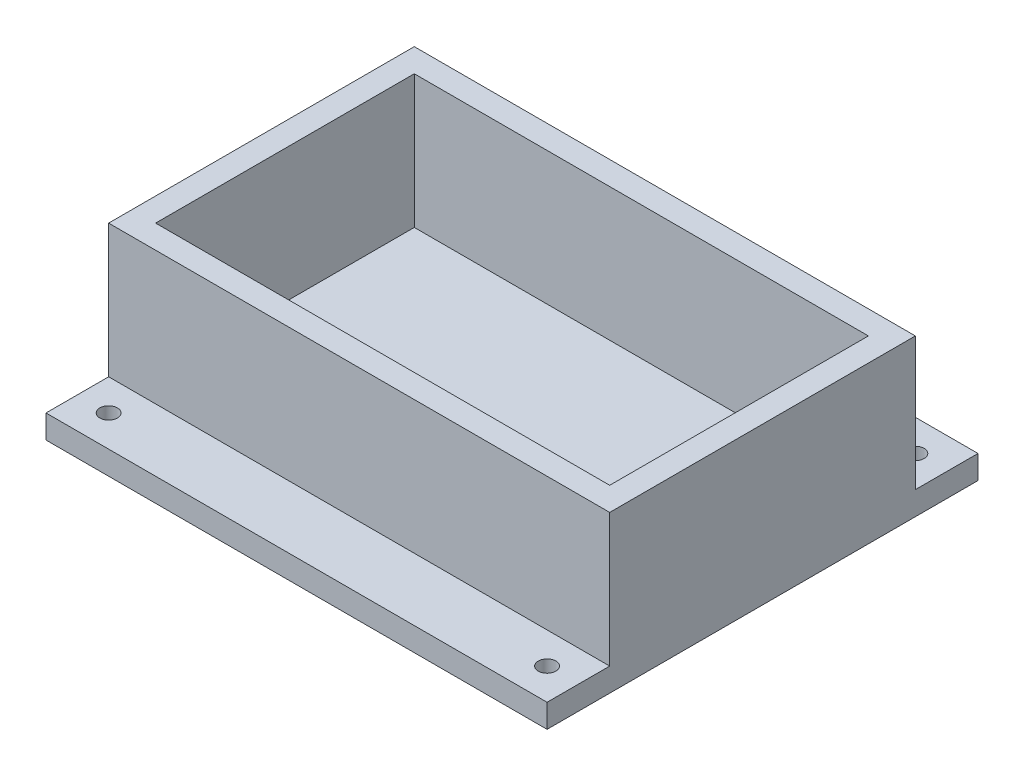
ISO-10303-21;
HEADER;
FILE_DESCRIPTION(('STEP AP214'),'2;1');
FILE_NAME('part.step','',(''),(''),'','','');
FILE_SCHEMA(('AUTOMOTIVE_DESIGN { 1 0 10303 214 1 1 1 1 }'));
ENDSEC;
DATA;
#1=APPLICATION_CONTEXT('core data for automotive mechanical design processes');
#2=APPLICATION_PROTOCOL_DEFINITION('international standard','automotive_design',2000,#1);
#3=PRODUCT_CONTEXT('',#1,'mechanical');
#4=PRODUCT('Part','Part','',(#3));
#5=PRODUCT_RELATED_PRODUCT_CATEGORY('part','',(#4));
#6=PRODUCT_DEFINITION_FORMATION('','',#4);
#7=PRODUCT_DEFINITION_CONTEXT('part definition',#1,'design');
#8=PRODUCT_DEFINITION('design','',#6,#7);
#9=PRODUCT_DEFINITION_SHAPE('','',#8);
#10=(LENGTH_UNIT() NAMED_UNIT(*) SI_UNIT(.MILLI.,.METRE.));
#11=(NAMED_UNIT(*) PLANE_ANGLE_UNIT() SI_UNIT($,.RADIAN.));
#12=(NAMED_UNIT(*) SI_UNIT($,.STERADIAN.) SOLID_ANGLE_UNIT());
#13=UNCERTAINTY_MEASURE_WITH_UNIT(LENGTH_MEASURE(1.E-05),#10,'distance_accuracy_value','');
#14=(GEOMETRIC_REPRESENTATION_CONTEXT(3) GLOBAL_UNCERTAINTY_ASSIGNED_CONTEXT((#13)) GLOBAL_UNIT_ASSIGNED_CONTEXT((#10,
#11,#12)) REPRESENTATION_CONTEXT('',''));
#15=CARTESIAN_POINT('',(0.,0.,0.));
#16=DIRECTION('',(0.,0.,1.));
#17=DIRECTION('',(1.,0.,0.));
#18=AXIS2_PLACEMENT_3D('',#15,#16,#17);
#19=CARTESIAN_POINT('',(101.6,63.5,61.976));
#20=DIRECTION('',(0.,0.,-1.));
#21=DIRECTION('',(-1.,0.,0.));
#22=AXIS2_PLACEMENT_3D('',#19,#20,#21);
#23=PLANE('',#22);
#24=DIRECTION('',(-1.,0.,0.));
#25=VECTOR('',#24,1.);
#26=CARTESIAN_POINT('',(-101.6,9.525,61.976));
#27=LINE('',#26,#25);
#28=CARTESIAN_POINT('',(101.6,9.525,61.976));
#29=VERTEX_POINT('',#28);
#30=CARTESIAN_POINT('',(-101.6,9.525,61.976));
#31=VERTEX_POINT('',#30);
#32=EDGE_CURVE('E67',#29,#31,#27,.T.);
#33=ORIENTED_EDGE('',*,*,#32,.F.);
#34=DIRECTION('',(0.,-1.,0.));
#35=VECTOR('',#34,1.);
#36=CARTESIAN_POINT('',(101.6,63.5,61.976));
#37=LINE('',#36,#35);
#38=CARTESIAN_POINT('',(101.6,63.5,61.976));
#39=VERTEX_POINT('',#38);
#40=EDGE_CURVE('E61',#39,#29,#37,.T.);
#41=ORIENTED_EDGE('',*,*,#40,.F.);
#42=DIRECTION('',(1.,0.,0.));
#43=VECTOR('',#42,1.);
#44=CARTESIAN_POINT('',(101.6,63.5,61.976));
#45=LINE('',#44,#43);
#46=CARTESIAN_POINT('',(-101.6,63.5,61.976));
#47=VERTEX_POINT('',#46);
#48=EDGE_CURVE('E381',#47,#39,#45,.T.);
#49=ORIENTED_EDGE('',*,*,#48,.F.);
#50=DIRECTION('',(0.,-1.,0.));
#51=VECTOR('',#50,1.);
#52=CARTESIAN_POINT('',(-101.6,63.5,61.976));
#53=LINE('',#52,#51);
#54=EDGE_CURVE('E12',#47,#31,#53,.T.);
#55=ORIENTED_EDGE('',*,*,#54,.T.);
#56=EDGE_LOOP('',(#33,#41,#49,#55));
#57=FACE_BOUND('',#56,.T.);
#58=ADVANCED_FACE('F52',(#57),#23,.F.);
#59=CARTESIAN_POINT('',(101.6,63.5,-61.976));
#60=DIRECTION('',(0.,0.,1.));
#61=DIRECTION('',(1.,0.,0.));
#62=AXIS2_PLACEMENT_3D('',#59,#60,#61);
#63=PLANE('',#62);
#64=DIRECTION('',(1.,0.,0.));
#65=VECTOR('',#64,1.);
#66=CARTESIAN_POINT('',(-101.6,9.525,-61.976));
#67=LINE('',#66,#65);
#68=CARTESIAN_POINT('',(-101.6,9.525,-61.976));
#69=VERTEX_POINT('',#68);
#70=CARTESIAN_POINT('',(101.6,9.525,-61.976));
#71=VERTEX_POINT('',#70);
#72=EDGE_CURVE('E75',#69,#71,#67,.T.);
#73=ORIENTED_EDGE('',*,*,#72,.F.);
#74=DIRECTION('',(0.,-1.,0.));
#75=VECTOR('',#74,1.);
#76=CARTESIAN_POINT('',(-101.6,63.5,-61.976));
#77=LINE('',#76,#75);
#78=CARTESIAN_POINT('',(-101.6,63.5,-61.976));
#79=VERTEX_POINT('',#78);
#80=EDGE_CURVE('E202',#79,#69,#77,.T.);
#81=ORIENTED_EDGE('',*,*,#80,.F.);
#82=DIRECTION('',(-1.,0.,0.));
#83=VECTOR('',#82,1.);
#84=CARTESIAN_POINT('',(101.6,63.5,-61.976));
#85=LINE('',#84,#83);
#86=CARTESIAN_POINT('',(101.6,63.5,-61.976));
#87=VERTEX_POINT('',#86);
#88=EDGE_CURVE('E198',#87,#79,#85,.T.);
#89=ORIENTED_EDGE('',*,*,#88,.F.);
#90=DIRECTION('',(0.,-1.,0.));
#91=VECTOR('',#90,1.);
#92=CARTESIAN_POINT('',(101.6,63.5,-61.976));
#93=LINE('',#92,#91);
#94=EDGE_CURVE('E392',#87,#71,#93,.T.);
#95=ORIENTED_EDGE('',*,*,#94,.T.);
#96=EDGE_LOOP('',(#73,#81,#89,#95));
#97=FACE_BOUND('',#96,.T.);
#98=ADVANCED_FACE('F394',(#97),#63,.F.);
#99=CARTESIAN_POINT('',(-101.6,63.5,61.976));
#100=DIRECTION('',(1.,0.,0.));
#101=DIRECTION('',(0.,0.,-1.));
#102=AXIS2_PLACEMENT_3D('',#99,#100,#101);
#103=PLANE('',#102);
#104=DIRECTION('',(0.,0.,1.));
#105=VECTOR('',#104,1.);
#106=CARTESIAN_POINT('',(-101.6,0.,61.976));
#107=LINE('',#106,#105);
#108=CARTESIAN_POINT('',(-101.6,0.,-87.376));
#109=VERTEX_POINT('',#108);
#110=CARTESIAN_POINT('',(-101.6,0.,87.376));
#111=VERTEX_POINT('',#110);
#112=EDGE_CURVE('E156',#109,#111,#107,.T.);
#113=ORIENTED_EDGE('',*,*,#112,.T.);
#114=DIRECTION('',(0.,1.,0.));
#115=VECTOR('',#114,1.);
#116=CARTESIAN_POINT('',(-101.6,0.,87.376));
#117=LINE('',#116,#115);
#118=CARTESIAN_POINT('',(-101.6,9.525,87.376));
#119=VERTEX_POINT('',#118);
#120=EDGE_CURVE('E337',#111,#119,#117,.T.);
#121=ORIENTED_EDGE('',*,*,#120,.T.);
#122=DIRECTION('',(0.,0.,1.));
#123=VECTOR('',#122,1.);
#124=CARTESIAN_POINT('',(-101.6,9.525,61.976));
#125=LINE('',#124,#123);
#126=EDGE_CURVE('E276',#31,#119,#125,.T.);
#127=ORIENTED_EDGE('',*,*,#126,.F.);
#128=ORIENTED_EDGE('',*,*,#54,.F.);
#129=DIRECTION('',(0.,0.,1.));
#130=VECTOR('',#129,1.);
#131=CARTESIAN_POINT('',(-101.6,63.5,61.976));
#132=LINE('',#131,#130);
#133=EDGE_CURVE('E155',#79,#47,#132,.T.);
#134=ORIENTED_EDGE('',*,*,#133,.F.);
#135=ORIENTED_EDGE('',*,*,#80,.T.);
#136=DIRECTION('',(0.,0.,1.));
#137=VECTOR('',#136,1.);
#138=CARTESIAN_POINT('',(-101.6,9.525,-61.976));
#139=LINE('',#138,#137);
#140=CARTESIAN_POINT('',(-101.6,9.525,-87.376));
#141=VERTEX_POINT('',#140);
#142=EDGE_CURVE('E182',#141,#69,#139,.T.);
#143=ORIENTED_EDGE('',*,*,#142,.F.);
#144=DIRECTION('',(0.,1.,0.));
#145=VECTOR('',#144,1.);
#146=CARTESIAN_POINT('',(-101.6,0.,-87.376));
#147=LINE('',#146,#145);
#148=EDGE_CURVE('E166',#109,#141,#147,.T.);
#149=ORIENTED_EDGE('',*,*,#148,.F.);
#150=EDGE_LOOP('',(#113,#121,#127,#128,#134,#135,#143,#149));
#151=FACE_BOUND('',#150,.T.);
#152=ADVANCED_FACE('F54',(#151),#103,.F.);
#153=CARTESIAN_POINT('',(101.6,63.5,61.976));
#154=DIRECTION('',(-1.,0.,0.));
#155=DIRECTION('',(0.,0.,1.));
#156=AXIS2_PLACEMENT_3D('',#153,#154,#155);
#157=PLANE('',#156);
#158=DIRECTION('',(0.,0.,-1.));
#159=VECTOR('',#158,1.);
#160=CARTESIAN_POINT('',(101.6,0.,61.976));
#161=LINE('',#160,#159);
#162=CARTESIAN_POINT('',(101.6,0.,87.376));
#163=VERTEX_POINT('',#162);
#164=CARTESIAN_POINT('',(101.6,0.,-87.376));
#165=VERTEX_POINT('',#164);
#166=EDGE_CURVE('E142',#163,#165,#161,.T.);
#167=ORIENTED_EDGE('',*,*,#166,.T.);
#168=DIRECTION('',(0.,1.,0.));
#169=VECTOR('',#168,1.);
#170=CARTESIAN_POINT('',(101.6,0.,-87.376));
#171=LINE('',#170,#169);
#172=CARTESIAN_POINT('',(101.6,9.525,-87.376));
#173=VERTEX_POINT('',#172);
#174=EDGE_CURVE('E146',#165,#173,#171,.T.);
#175=ORIENTED_EDGE('',*,*,#174,.T.);
#176=DIRECTION('',(0.,0.,-1.));
#177=VECTOR('',#176,1.);
#178=CARTESIAN_POINT('',(101.6,9.525,-61.976));
#179=LINE('',#178,#177);
#180=EDGE_CURVE('E174',#71,#173,#179,.T.);
#181=ORIENTED_EDGE('',*,*,#180,.F.);
#182=ORIENTED_EDGE('',*,*,#94,.F.);
#183=DIRECTION('',(0.,0.,-1.));
#184=VECTOR('',#183,1.);
#185=CARTESIAN_POINT('',(101.6,63.5,61.976));
#186=LINE('',#185,#184);
#187=EDGE_CURVE('E203',#39,#87,#186,.T.);
#188=ORIENTED_EDGE('',*,*,#187,.F.);
#189=ORIENTED_EDGE('',*,*,#40,.T.);
#190=DIRECTION('',(0.,0.,-1.));
#191=VECTOR('',#190,1.);
#192=CARTESIAN_POINT('',(101.6,9.525,61.976));
#193=LINE('',#192,#191);
#194=CARTESIAN_POINT('',(101.6,9.525,87.376));
#195=VERTEX_POINT('',#194);
#196=EDGE_CURVE('E341',#195,#29,#193,.T.);
#197=ORIENTED_EDGE('',*,*,#196,.F.);
#198=DIRECTION('',(0.,1.,0.));
#199=VECTOR('',#198,1.);
#200=CARTESIAN_POINT('',(101.6,0.,87.376));
#201=LINE('',#200,#199);
#202=EDGE_CURVE('E149',#163,#195,#201,.T.);
#203=ORIENTED_EDGE('',*,*,#202,.F.);
#204=EDGE_LOOP('',(#167,#175,#181,#182,#188,#189,#197,#203));
#205=FACE_BOUND('',#204,.T.);
#206=ADVANCED_FACE('F144',(#205),#157,.F.);
#207=CARTESIAN_POINT('',(0.,63.5,0.));
#208=DIRECTION('',(0.,1.,0.));
#209=DIRECTION('',(0.,0.,1.));
#210=AXIS2_PLACEMENT_3D('',#207,#208,#209);
#211=PLANE('',#210);
#212=DIRECTION('',(0.,0.,1.));
#213=VECTOR('',#212,1.);
#214=CARTESIAN_POINT('',(-92.075,63.5,61.976));
#215=LINE('',#214,#213);
#216=CARTESIAN_POINT('',(-92.075,63.5,-52.451));
#217=VERTEX_POINT('',#216);
#218=CARTESIAN_POINT('',(-92.075,63.5,52.451));
#219=VERTEX_POINT('',#218);
#220=EDGE_CURVE('E220',#217,#219,#215,.T.);
#221=ORIENTED_EDGE('',*,*,#220,.F.);
#222=DIRECTION('',(-1.,0.,0.));
#223=VECTOR('',#222,1.);
#224=CARTESIAN_POINT('',(101.6,63.5,-52.451));
#225=LINE('',#224,#223);
#226=CARTESIAN_POINT('',(92.075,63.5,-52.451));
#227=VERTEX_POINT('',#226);
#228=EDGE_CURVE('E382',#227,#217,#225,.T.);
#229=ORIENTED_EDGE('',*,*,#228,.F.);
#230=DIRECTION('',(0.,0.,-1.));
#231=VECTOR('',#230,1.);
#232=CARTESIAN_POINT('',(92.075,63.5,61.976));
#233=LINE('',#232,#231);
#234=CARTESIAN_POINT('',(92.075,63.5,52.451));
#235=VERTEX_POINT('',#234);
#236=EDGE_CURVE('E219',#235,#227,#233,.T.);
#237=ORIENTED_EDGE('',*,*,#236,.F.);
#238=DIRECTION('',(1.,0.,0.));
#239=VECTOR('',#238,1.);
#240=CARTESIAN_POINT('',(101.6,63.5,52.451));
#241=LINE('',#240,#239);
#242=EDGE_CURVE('E214',#219,#235,#241,.T.);
#243=ORIENTED_EDGE('',*,*,#242,.F.);
#244=EDGE_LOOP('',(#221,#229,#237,#243));
#245=FACE_BOUND('',#244,.T.);
#246=ORIENTED_EDGE('',*,*,#133,.T.);
#247=ORIENTED_EDGE('',*,*,#48,.T.);
#248=ORIENTED_EDGE('',*,*,#187,.T.);
#249=ORIENTED_EDGE('',*,*,#88,.T.);
#250=EDGE_LOOP('',(#246,#247,#248,#249));
#251=FACE_BOUND('',#250,.T.);
#252=ADVANCED_FACE('F390',(#245,#251),#211,.T.);
#253=CARTESIAN_POINT('',(0.,0.,0.));
#254=DIRECTION('',(0.,1.,0.));
#255=DIRECTION('',(0.,0.,1.));
#256=AXIS2_PLACEMENT_3D('',#253,#254,#255);
#257=PLANE('',#256);
#258=ORIENTED_EDGE('',*,*,#112,.F.);
#259=DIRECTION('',(-1.,0.,0.));
#260=VECTOR('',#259,1.);
#261=CARTESIAN_POINT('',(-101.6,0.,-87.376));
#262=LINE('',#261,#260);
#263=EDGE_CURVE('E162',#165,#109,#262,.T.);
#264=ORIENTED_EDGE('',*,*,#263,.F.);
#265=ORIENTED_EDGE('',*,*,#166,.F.);
#266=DIRECTION('',(1.,0.,0.));
#267=VECTOR('',#266,1.);
#268=CARTESIAN_POINT('',(-101.6,0.,87.376));
#269=LINE('',#268,#267);
#270=EDGE_CURVE('E286',#111,#163,#269,.T.);
#271=ORIENTED_EDGE('',*,*,#270,.F.);
#272=EDGE_LOOP('',(#258,#264,#265,#271));
#273=FACE_BOUND('',#272,.T.);
#274=CARTESIAN_POINT('',(88.9,0.,-74.676));
#275=DIRECTION('',(0.,1.,0.));
#276=DIRECTION('',(0.,0.,1.));
#277=AXIS2_PLACEMENT_3D('',#274,#275,#276);
#278=CIRCLE('',#277,3.56870000000001);
#279=CARTESIAN_POINT('',(88.9,0.,-71.1073));
#280=VERTEX_POINT('',#279);
#281=EDGE_CURVE('E374',#280,#280,#278,.T.);
#282=ORIENTED_EDGE('',*,*,#281,.T.);
#283=EDGE_LOOP('',(#282));
#284=FACE_BOUND('',#283,.T.);
#285=CARTESIAN_POINT('',(-88.9,0.,-74.676));
#286=DIRECTION('',(0.,1.,0.));
#287=DIRECTION('',(0.,0.,1.));
#288=AXIS2_PLACEMENT_3D('',#285,#286,#287);
#289=CIRCLE('',#288,3.56870000000001);
#290=CARTESIAN_POINT('',(-88.9,0.,-71.1073));
#291=VERTEX_POINT('',#290);
#292=EDGE_CURVE('E375',#291,#291,#289,.T.);
#293=ORIENTED_EDGE('',*,*,#292,.T.);
#294=EDGE_LOOP('',(#293));
#295=FACE_BOUND('',#294,.T.);
#296=CARTESIAN_POINT('',(-88.9,0.,74.676));
#297=DIRECTION('',(0.,1.,0.));
#298=DIRECTION('',(0.,0.,1.));
#299=AXIS2_PLACEMENT_3D('',#296,#297,#298);
#300=CIRCLE('',#299,3.56870000000001);
#301=CARTESIAN_POINT('',(-88.9,0.,78.2447));
#302=VERTEX_POINT('',#301);
#303=EDGE_CURVE('E235',#302,#302,#300,.T.);
#304=ORIENTED_EDGE('',*,*,#303,.T.);
#305=EDGE_LOOP('',(#304));
#306=FACE_BOUND('',#305,.T.);
#307=CARTESIAN_POINT('',(88.9,0.,74.676));
#308=DIRECTION('',(0.,1.,0.));
#309=DIRECTION('',(0.,0.,1.));
#310=AXIS2_PLACEMENT_3D('',#307,#308,#309);
#311=CIRCLE('',#310,3.56870000000001);
#312=CARTESIAN_POINT('',(88.9,0.,78.2447));
#313=VERTEX_POINT('',#312);
#314=EDGE_CURVE('E282',#313,#313,#311,.T.);
#315=ORIENTED_EDGE('',*,*,#314,.T.);
#316=EDGE_LOOP('',(#315));
#317=FACE_BOUND('',#316,.T.);
#318=ADVANCED_FACE('F168',(#273,#284,#295,#306,#317),#257,.F.);
#319=CARTESIAN_POINT('',(-92.075,63.5,61.976));
#320=DIRECTION('',(1.,0.,0.));
#321=DIRECTION('',(0.,0.,-1.));
#322=AXIS2_PLACEMENT_3D('',#319,#320,#321);
#323=PLANE('',#322);
#324=DIRECTION('',(0.,0.,1.));
#325=VECTOR('',#324,1.);
#326=CARTESIAN_POINT('',(-92.075,9.525,61.976));
#327=LINE('',#326,#325);
#328=CARTESIAN_POINT('',(-92.075,9.525,-52.451));
#329=VERTEX_POINT('',#328);
#330=CARTESIAN_POINT('',(-92.075,9.525,52.451));
#331=VERTEX_POINT('',#330);
#332=EDGE_CURVE('E228',#329,#331,#327,.T.);
#333=ORIENTED_EDGE('',*,*,#332,.F.);
#334=DIRECTION('',(0.,-1.,0.));
#335=VECTOR('',#334,1.);
#336=CARTESIAN_POINT('',(-92.075,63.5,-52.451));
#337=LINE('',#336,#335);
#338=EDGE_CURVE('E256',#217,#329,#337,.T.);
#339=ORIENTED_EDGE('',*,*,#338,.F.);
#340=ORIENTED_EDGE('',*,*,#220,.T.);
#341=DIRECTION('',(0.,-1.,0.));
#342=VECTOR('',#341,1.);
#343=CARTESIAN_POINT('',(-92.075,63.5,52.451));
#344=LINE('',#343,#342);
#345=EDGE_CURVE('E238',#219,#331,#344,.T.);
#346=ORIENTED_EDGE('',*,*,#345,.T.);
#347=EDGE_LOOP('',(#333,#339,#340,#346));
#348=FACE_BOUND('',#347,.T.);
#349=ADVANCED_FACE('F417',(#348),#323,.T.);
#350=CARTESIAN_POINT('',(101.6,63.5,52.451));
#351=DIRECTION('',(0.,0.,-1.));
#352=DIRECTION('',(-1.,0.,0.));
#353=AXIS2_PLACEMENT_3D('',#350,#351,#352);
#354=PLANE('',#353);
#355=DIRECTION('',(1.,0.,0.));
#356=VECTOR('',#355,1.);
#357=CARTESIAN_POINT('',(101.6,9.525,52.451));
#358=LINE('',#357,#356);
#359=CARTESIAN_POINT('',(92.075,9.525,52.451));
#360=VERTEX_POINT('',#359);
#361=EDGE_CURVE('E234',#331,#360,#358,.T.);
#362=ORIENTED_EDGE('',*,*,#361,.F.);
#363=ORIENTED_EDGE('',*,*,#345,.F.);
#364=ORIENTED_EDGE('',*,*,#242,.T.);
#365=DIRECTION('',(0.,-1.,0.));
#366=VECTOR('',#365,1.);
#367=CARTESIAN_POINT('',(92.075,63.5,52.451));
#368=LINE('',#367,#366);
#369=EDGE_CURVE('E257',#235,#360,#368,.T.);
#370=ORIENTED_EDGE('',*,*,#369,.T.);
#371=EDGE_LOOP('',(#362,#363,#364,#370));
#372=FACE_BOUND('',#371,.T.);
#373=ADVANCED_FACE('F432',(#372),#354,.T.);
#374=CARTESIAN_POINT('',(92.075,63.5,61.976));
#375=DIRECTION('',(-1.,0.,0.));
#376=DIRECTION('',(0.,0.,1.));
#377=AXIS2_PLACEMENT_3D('',#374,#375,#376);
#378=PLANE('',#377);
#379=DIRECTION('',(0.,0.,-1.));
#380=VECTOR('',#379,1.);
#381=CARTESIAN_POINT('',(92.075,9.525,61.976));
#382=LINE('',#381,#380);
#383=CARTESIAN_POINT('',(92.075,9.525,-52.451));
#384=VERTEX_POINT('',#383);
#385=EDGE_CURVE('E255',#360,#384,#382,.T.);
#386=ORIENTED_EDGE('',*,*,#385,.F.);
#387=ORIENTED_EDGE('',*,*,#369,.F.);
#388=ORIENTED_EDGE('',*,*,#236,.T.);
#389=DIRECTION('',(0.,-1.,0.));
#390=VECTOR('',#389,1.);
#391=CARTESIAN_POINT('',(92.075,63.5,-52.451));
#392=LINE('',#391,#390);
#393=EDGE_CURVE('E261',#227,#384,#392,.T.);
#394=ORIENTED_EDGE('',*,*,#393,.T.);
#395=EDGE_LOOP('',(#386,#387,#388,#394));
#396=FACE_BOUND('',#395,.T.);
#397=ADVANCED_FACE('F428',(#396),#378,.T.);
#398=CARTESIAN_POINT('',(101.6,63.5,-52.451));
#399=DIRECTION('',(0.,0.,1.));
#400=DIRECTION('',(1.,0.,0.));
#401=AXIS2_PLACEMENT_3D('',#398,#399,#400);
#402=PLANE('',#401);
#403=DIRECTION('',(-1.,0.,0.));
#404=VECTOR('',#403,1.);
#405=CARTESIAN_POINT('',(101.6,9.525,-52.451));
#406=LINE('',#405,#404);
#407=EDGE_CURVE('E264',#384,#329,#406,.T.);
#408=ORIENTED_EDGE('',*,*,#407,.F.);
#409=ORIENTED_EDGE('',*,*,#393,.F.);
#410=ORIENTED_EDGE('',*,*,#228,.T.);
#411=ORIENTED_EDGE('',*,*,#338,.T.);
#412=EDGE_LOOP('',(#408,#409,#410,#411));
#413=FACE_BOUND('',#412,.T.);
#414=ADVANCED_FACE('F424',(#413),#402,.T.);
#415=CARTESIAN_POINT('',(0.,9.525,0.));
#416=DIRECTION('',(0.,1.,0.));
#417=DIRECTION('',(0.,0.,1.));
#418=AXIS2_PLACEMENT_3D('',#415,#416,#417);
#419=PLANE('',#418);
#420=ORIENTED_EDGE('',*,*,#332,.T.);
#421=ORIENTED_EDGE('',*,*,#361,.T.);
#422=ORIENTED_EDGE('',*,*,#385,.T.);
#423=ORIENTED_EDGE('',*,*,#407,.T.);
#424=EDGE_LOOP('',(#420,#421,#422,#423));
#425=FACE_BOUND('',#424,.T.);
#426=ADVANCED_FACE('F421',(#425),#419,.T.);
#427=CARTESIAN_POINT('',(-101.6,0.,-87.376));
#428=DIRECTION('',(0.,0.,-1.));
#429=DIRECTION('',(-1.,0.,0.));
#430=AXIS2_PLACEMENT_3D('',#427,#428,#429);
#431=PLANE('',#430);
#432=DIRECTION('',(-1.,0.,0.));
#433=VECTOR('',#432,1.);
#434=CARTESIAN_POINT('',(-101.6,9.525,-87.376));
#435=LINE('',#434,#433);
#436=EDGE_CURVE('E164',#173,#141,#435,.T.);
#437=ORIENTED_EDGE('',*,*,#436,.F.);
#438=ORIENTED_EDGE('',*,*,#174,.F.);
#439=ORIENTED_EDGE('',*,*,#263,.T.);
#440=ORIENTED_EDGE('',*,*,#148,.T.);
#441=EDGE_LOOP('',(#437,#438,#439,#440));
#442=FACE_BOUND('',#441,.T.);
#443=ADVANCED_FACE('F161',(#442),#431,.T.);
#444=CARTESIAN_POINT('',(0.,9.525,0.));
#445=DIRECTION('',(0.,-1.,0.));
#446=DIRECTION('',(0.,0.,-1.));
#447=AXIS2_PLACEMENT_3D('',#444,#445,#446);
#448=PLANE('',#447);
#449=CARTESIAN_POINT('',(88.9,9.525,-74.676));
#450=DIRECTION('',(0.,1.,0.));
#451=DIRECTION('',(0.,0.,1.));
#452=AXIS2_PLACEMENT_3D('',#449,#450,#451);
#453=CIRCLE('',#452,3.56870000000001);
#454=CARTESIAN_POINT('',(88.9,9.525,-71.1073));
#455=VERTEX_POINT('',#454);
#456=EDGE_CURVE('E298',#455,#455,#453,.T.);
#457=ORIENTED_EDGE('',*,*,#456,.F.);
#458=EDGE_LOOP('',(#457));
#459=FACE_BOUND('',#458,.T.);
#460=CARTESIAN_POINT('',(-88.9,9.525,-74.676));
#461=DIRECTION('',(0.,1.,0.));
#462=DIRECTION('',(0.,0.,1.));
#463=AXIS2_PLACEMENT_3D('',#460,#461,#462);
#464=CIRCLE('',#463,3.56870000000001);
#465=CARTESIAN_POINT('',(-88.9,9.525,-71.1073));
#466=VERTEX_POINT('',#465);
#467=EDGE_CURVE('E179',#466,#466,#464,.T.);
#468=ORIENTED_EDGE('',*,*,#467,.F.);
#469=EDGE_LOOP('',(#468));
#470=FACE_BOUND('',#469,.T.);
#471=ORIENTED_EDGE('',*,*,#142,.T.);
#472=ORIENTED_EDGE('',*,*,#72,.T.);
#473=ORIENTED_EDGE('',*,*,#180,.T.);
#474=ORIENTED_EDGE('',*,*,#436,.T.);
#475=EDGE_LOOP('',(#471,#472,#473,#474));
#476=FACE_BOUND('',#475,.T.);
#477=ADVANCED_FACE('F447',(#459,#470,#476),#448,.F.);
#478=CARTESIAN_POINT('',(-88.9,0.,-74.676));
#479=DIRECTION('',(0.,1.,0.));
#480=DIRECTION('',(0.,0.,1.));
#481=AXIS2_PLACEMENT_3D('',#478,#479,#480);
#482=CYLINDRICAL_SURFACE('',#481,3.56870000000001);
#483=CARTESIAN_POINT('',(-88.9,0.,-71.1073));
#484=CARTESIAN_POINT('',(-88.9,0.0992187499999999,-71.1073));
#485=CARTESIAN_POINT('',(-88.9,0.1984375,-71.1073));
#486=CARTESIAN_POINT('',(-88.9,0.396875,-71.1073));
#487=CARTESIAN_POINT('',(-88.9,0.49609375,-71.1073));
#488=CARTESIAN_POINT('',(-88.9,0.69453125,-71.1073));
#489=CARTESIAN_POINT('',(-88.9,0.79375,-71.1073));
#490=CARTESIAN_POINT('',(-88.9,0.9921875,-71.1073));
#491=CARTESIAN_POINT('',(-88.9,1.09140625,-71.1073));
#492=CARTESIAN_POINT('',(-88.9,1.28984375,-71.1073));
#493=CARTESIAN_POINT('',(-88.9,1.3890625,-71.1073));
#494=CARTESIAN_POINT('',(-88.9,1.5875,-71.1073));
#495=CARTESIAN_POINT('',(-88.9,1.68671875,-71.1073));
#496=CARTESIAN_POINT('',(-88.9,1.88515625,-71.1073));
#497=CARTESIAN_POINT('',(-88.9,1.984375,-71.1073));
#498=CARTESIAN_POINT('',(-88.9,2.1828125,-71.1073));
#499=CARTESIAN_POINT('',(-88.9,2.28203125,-71.1073));
#500=CARTESIAN_POINT('',(-88.9,2.48046875,-71.1073));
#501=CARTESIAN_POINT('',(-88.9,2.5796875,-71.1073));
#502=CARTESIAN_POINT('',(-88.9,2.778125,-71.1073));
#503=CARTESIAN_POINT('',(-88.9,2.87734375,-71.1073));
#504=CARTESIAN_POINT('',(-88.9,3.07578125,-71.1073));
#505=CARTESIAN_POINT('',(-88.9,3.175,-71.1073));
#506=CARTESIAN_POINT('',(-88.9,3.3734375,-71.1073));
#507=CARTESIAN_POINT('',(-88.9,3.47265625,-71.1073));
#508=CARTESIAN_POINT('',(-88.9,3.67109375,-71.1073));
#509=CARTESIAN_POINT('',(-88.9,3.7703125,-71.1073));
#510=CARTESIAN_POINT('',(-88.9,3.96875,-71.1073));
#511=CARTESIAN_POINT('',(-88.9,4.06796875,-71.1073));
#512=CARTESIAN_POINT('',(-88.9,4.26640625,-71.1073));
#513=CARTESIAN_POINT('',(-88.9,4.365625,-71.1073));
#514=CARTESIAN_POINT('',(-88.9,4.5640625,-71.1073));
#515=CARTESIAN_POINT('',(-88.9,4.66328125,-71.1073));
#516=CARTESIAN_POINT('',(-88.9,4.86171875,-71.1073));
#517=CARTESIAN_POINT('',(-88.9,4.9609375,-71.1073));
#518=CARTESIAN_POINT('',(-88.9,5.159375,-71.1073));
#519=CARTESIAN_POINT('',(-88.9,5.25859375,-71.1073));
#520=CARTESIAN_POINT('',(-88.9,5.45703125,-71.1073));
#521=CARTESIAN_POINT('',(-88.9,5.55625,-71.1073));
#522=CARTESIAN_POINT('',(-88.9,5.7546875,-71.1073));
#523=CARTESIAN_POINT('',(-88.9,5.85390625,-71.1073));
#524=CARTESIAN_POINT('',(-88.9,6.05234375,-71.1073));
#525=CARTESIAN_POINT('',(-88.9,6.1515625,-71.1073));
#526=CARTESIAN_POINT('',(-88.9,6.35,-71.1073));
#527=CARTESIAN_POINT('',(-88.9,6.44921875,-71.1073));
#528=CARTESIAN_POINT('',(-88.9,6.64765625,-71.1073));
#529=CARTESIAN_POINT('',(-88.9,6.746875,-71.1073));
#530=CARTESIAN_POINT('',(-88.9,6.9453125,-71.1073));
#531=CARTESIAN_POINT('',(-88.9,7.04453125,-71.1073));
#532=CARTESIAN_POINT('',(-88.9,7.24296875,-71.1073));
#533=CARTESIAN_POINT('',(-88.9,7.3421875,-71.1073));
#534=CARTESIAN_POINT('',(-88.9,7.540625,-71.1073));
#535=CARTESIAN_POINT('',(-88.9,7.63984375,-71.1073));
#536=CARTESIAN_POINT('',(-88.9,7.83828125,-71.1073));
#537=CARTESIAN_POINT('',(-88.9,7.9375,-71.1073));
#538=CARTESIAN_POINT('',(-88.9,8.1359375,-71.1073));
#539=CARTESIAN_POINT('',(-88.9,8.23515625,-71.1073));
#540=CARTESIAN_POINT('',(-88.9,8.43359375,-71.1073));
#541=CARTESIAN_POINT('',(-88.9,8.5328125,-71.1073));
#542=CARTESIAN_POINT('',(-88.9,8.73125,-71.1073));
#543=CARTESIAN_POINT('',(-88.9,8.83046875,-71.1073));
#544=CARTESIAN_POINT('',(-88.9,9.02890625,-71.1073));
#545=CARTESIAN_POINT('',(-88.9,9.128125,-71.1073));
#546=CARTESIAN_POINT('',(-88.9,9.3265625,-71.1073));
#547=CARTESIAN_POINT('',(-88.9,9.42578125,-71.1073));
#548=CARTESIAN_POINT('',(-88.9,9.525,-71.1073));
#549=B_SPLINE_CURVE_WITH_KNOTS('',3,(#483,#484,#485,#486,#487,#488,#489,#490,#491,#492,#493,
#494,#495,#496,#497,#498,#499,#500,#501,#502,#503,#504,#505,#506,#507,#508,#509,#510,#511,#512,
#513,#514,#515,#516,#517,#518,#519,#520,#521,#522,#523,#524,#525,#526,#527,#528,#529,#530,#531,
#532,#533,#534,#535,#536,#537,#538,#539,#540,#541,#542,#543,#544,#545,#546,#547,#548),
.UNSPECIFIED.,.F.,.F.,(4,2,2,2,2,2,2,2,2,2,2,2,2,2,2,2,2,2,2,2,2,2,2,2,2,2,2,2,2,2,2,2,4),(0.,
0.29765625,0.5953125,0.89296875,1.190625,1.48828125,1.7859375,2.08359375,2.38125,2.67890625,
2.9765625,3.27421875,3.571875,3.86953125,4.1671875,4.46484375,4.7625,5.06015625,5.3578125,
5.65546875,5.953125,6.25078125,6.5484375,6.84609375,7.14375,7.44140625,7.7390625,8.03671875,
8.334375,8.63203125,8.9296875,9.22734375,9.525),.UNSPECIFIED.);
#550=EDGE_CURVE('BSEAM450',#291,#466,#549,.T.);
#551=ORIENTED_EDGE('',*,*,#292,.F.);
#552=ORIENTED_EDGE('',*,*,#467,.T.);
#553=ORIENTED_EDGE('',*,*,#550,.T.);
#554=ORIENTED_EDGE('',*,*,#550,.F.);
#555=EDGE_LOOP('',(#551,#553,#552,#554));
#556=FACE_BOUND('',#555,.T.);
#557=ADVANCED_FACE('F450',(#556),#482,.F.);
#558=CARTESIAN_POINT('',(88.9,0.,-74.676));
#559=DIRECTION('',(0.,1.,0.));
#560=DIRECTION('',(0.,0.,1.));
#561=AXIS2_PLACEMENT_3D('',#558,#559,#560);
#562=CYLINDRICAL_SURFACE('',#561,3.56870000000001);
#563=CARTESIAN_POINT('',(88.9,0.,-71.1073));
#564=CARTESIAN_POINT('',(88.9,0.0992187499999999,-71.1073));
#565=CARTESIAN_POINT('',(88.9,0.1984375,-71.1073));
#566=CARTESIAN_POINT('',(88.9,0.396875,-71.1073));
#567=CARTESIAN_POINT('',(88.9,0.49609375,-71.1073));
#568=CARTESIAN_POINT('',(88.9,0.69453125,-71.1073));
#569=CARTESIAN_POINT('',(88.9,0.79375,-71.1073));
#570=CARTESIAN_POINT('',(88.9,0.9921875,-71.1073));
#571=CARTESIAN_POINT('',(88.9,1.09140625,-71.1073));
#572=CARTESIAN_POINT('',(88.9,1.28984375,-71.1073));
#573=CARTESIAN_POINT('',(88.9,1.3890625,-71.1073));
#574=CARTESIAN_POINT('',(88.9,1.5875,-71.1073));
#575=CARTESIAN_POINT('',(88.9,1.68671875,-71.1073));
#576=CARTESIAN_POINT('',(88.9,1.88515625,-71.1073));
#577=CARTESIAN_POINT('',(88.9,1.984375,-71.1073));
#578=CARTESIAN_POINT('',(88.9,2.1828125,-71.1073));
#579=CARTESIAN_POINT('',(88.9,2.28203125,-71.1073));
#580=CARTESIAN_POINT('',(88.9,2.48046875,-71.1073));
#581=CARTESIAN_POINT('',(88.9,2.5796875,-71.1073));
#582=CARTESIAN_POINT('',(88.9,2.778125,-71.1073));
#583=CARTESIAN_POINT('',(88.9,2.87734375,-71.1073));
#584=CARTESIAN_POINT('',(88.9,3.07578125,-71.1073));
#585=CARTESIAN_POINT('',(88.9,3.175,-71.1073));
#586=CARTESIAN_POINT('',(88.9,3.3734375,-71.1073));
#587=CARTESIAN_POINT('',(88.9,3.47265625,-71.1073));
#588=CARTESIAN_POINT('',(88.9,3.67109375,-71.1073));
#589=CARTESIAN_POINT('',(88.9,3.7703125,-71.1073));
#590=CARTESIAN_POINT('',(88.9,3.96875,-71.1073));
#591=CARTESIAN_POINT('',(88.9,4.06796875,-71.1073));
#592=CARTESIAN_POINT('',(88.9,4.26640625,-71.1073));
#593=CARTESIAN_POINT('',(88.9,4.365625,-71.1073));
#594=CARTESIAN_POINT('',(88.9,4.5640625,-71.1073));
#595=CARTESIAN_POINT('',(88.9,4.66328125,-71.1073));
#596=CARTESIAN_POINT('',(88.9,4.86171875,-71.1073));
#597=CARTESIAN_POINT('',(88.9,4.9609375,-71.1073));
#598=CARTESIAN_POINT('',(88.9,5.159375,-71.1073));
#599=CARTESIAN_POINT('',(88.9,5.25859375,-71.1073));
#600=CARTESIAN_POINT('',(88.9,5.45703125,-71.1073));
#601=CARTESIAN_POINT('',(88.9,5.55625,-71.1073));
#602=CARTESIAN_POINT('',(88.9,5.7546875,-71.1073));
#603=CARTESIAN_POINT('',(88.9,5.85390625,-71.1073));
#604=CARTESIAN_POINT('',(88.9,6.05234375,-71.1073));
#605=CARTESIAN_POINT('',(88.9,6.1515625,-71.1073));
#606=CARTESIAN_POINT('',(88.9,6.35,-71.1073));
#607=CARTESIAN_POINT('',(88.9,6.44921875,-71.1073));
#608=CARTESIAN_POINT('',(88.9,6.64765625,-71.1073));
#609=CARTESIAN_POINT('',(88.9,6.746875,-71.1073));
#610=CARTESIAN_POINT('',(88.9,6.9453125,-71.1073));
#611=CARTESIAN_POINT('',(88.9,7.04453125,-71.1073));
#612=CARTESIAN_POINT('',(88.9,7.24296875,-71.1073));
#613=CARTESIAN_POINT('',(88.9,7.3421875,-71.1073));
#614=CARTESIAN_POINT('',(88.9,7.540625,-71.1073));
#615=CARTESIAN_POINT('',(88.9,7.63984375,-71.1073));
#616=CARTESIAN_POINT('',(88.9,7.83828125,-71.1073));
#617=CARTESIAN_POINT('',(88.9,7.9375,-71.1073));
#618=CARTESIAN_POINT('',(88.9,8.1359375,-71.1073));
#619=CARTESIAN_POINT('',(88.9,8.23515625,-71.1073));
#620=CARTESIAN_POINT('',(88.9,8.43359375,-71.1073));
#621=CARTESIAN_POINT('',(88.9,8.5328125,-71.1073));
#622=CARTESIAN_POINT('',(88.9,8.73125,-71.1073));
#623=CARTESIAN_POINT('',(88.9,8.83046875,-71.1073));
#624=CARTESIAN_POINT('',(88.9,9.02890625,-71.1073));
#625=CARTESIAN_POINT('',(88.9,9.128125,-71.1073));
#626=CARTESIAN_POINT('',(88.9,9.3265625,-71.1073));
#627=CARTESIAN_POINT('',(88.9,9.42578125,-71.1073));
#628=CARTESIAN_POINT('',(88.9,9.525,-71.1073));
#629=B_SPLINE_CURVE_WITH_KNOTS('',3,(#563,#564,#565,#566,#567,#568,#569,#570,#571,#572,#573,
#574,#575,#576,#577,#578,#579,#580,#581,#582,#583,#584,#585,#586,#587,#588,#589,#590,#591,#592,
#593,#594,#595,#596,#597,#598,#599,#600,#601,#602,#603,#604,#605,#606,#607,#608,#609,#610,#611,
#612,#613,#614,#615,#616,#617,#618,#619,#620,#621,#622,#623,#624,#625,#626,#627,#628),
.UNSPECIFIED.,.F.,.F.,(4,2,2,2,2,2,2,2,2,2,2,2,2,2,2,2,2,2,2,2,2,2,2,2,2,2,2,2,2,2,2,2,4),(0.,
0.29765625,0.5953125,0.89296875,1.190625,1.48828125,1.7859375,2.08359375,2.38125,2.67890625,
2.9765625,3.27421875,3.571875,3.86953125,4.1671875,4.46484375,4.7625,5.06015625,5.3578125,
5.65546875,5.953125,6.25078125,6.5484375,6.84609375,7.14375,7.44140625,7.7390625,8.03671875,
8.334375,8.63203125,8.9296875,9.22734375,9.525),.UNSPECIFIED.);
#630=EDGE_CURVE('BSEAM444',#280,#455,#629,.T.);
#631=ORIENTED_EDGE('',*,*,#281,.F.);
#632=ORIENTED_EDGE('',*,*,#456,.T.);
#633=ORIENTED_EDGE('',*,*,#630,.T.);
#634=ORIENTED_EDGE('',*,*,#630,.F.);
#635=EDGE_LOOP('',(#631,#633,#632,#634));
#636=FACE_BOUND('',#635,.T.);
#637=ADVANCED_FACE('F444',(#636),#562,.F.);
#638=CARTESIAN_POINT('',(-101.6,0.,87.376));
#639=DIRECTION('',(0.,0.,1.));
#640=DIRECTION('',(1.,0.,0.));
#641=AXIS2_PLACEMENT_3D('',#638,#639,#640);
#642=PLANE('',#641);
#643=DIRECTION('',(1.,0.,0.));
#644=VECTOR('',#643,1.);
#645=CARTESIAN_POINT('',(-101.6,9.525,87.376));
#646=LINE('',#645,#644);
#647=EDGE_CURVE('E283',#119,#195,#646,.T.);
#648=ORIENTED_EDGE('',*,*,#647,.F.);
#649=ORIENTED_EDGE('',*,*,#120,.F.);
#650=ORIENTED_EDGE('',*,*,#270,.T.);
#651=ORIENTED_EDGE('',*,*,#202,.T.);
#652=EDGE_LOOP('',(#648,#649,#650,#651));
#653=FACE_BOUND('',#652,.T.);
#654=ADVANCED_FACE('F326',(#653),#642,.T.);
#655=CARTESIAN_POINT('',(0.,9.525,0.));
#656=DIRECTION('',(0.,1.,0.));
#657=DIRECTION('',(0.,0.,1.));
#658=AXIS2_PLACEMENT_3D('',#655,#656,#657);
#659=PLANE('',#658);
#660=CARTESIAN_POINT('',(-88.9,9.525,74.676));
#661=DIRECTION('',(0.,1.,0.));
#662=DIRECTION('',(0.,0.,1.));
#663=AXIS2_PLACEMENT_3D('',#660,#661,#662);
#664=CIRCLE('',#663,3.56870000000001);
#665=CARTESIAN_POINT('',(-88.9,9.525,78.2447));
#666=VERTEX_POINT('',#665);
#667=EDGE_CURVE('E293',#666,#666,#664,.T.);
#668=ORIENTED_EDGE('',*,*,#667,.F.);
#669=EDGE_LOOP('',(#668));
#670=FACE_BOUND('',#669,.T.);
#671=CARTESIAN_POINT('',(88.9,9.525,74.676));
#672=DIRECTION('',(0.,1.,0.));
#673=DIRECTION('',(0.,0.,1.));
#674=AXIS2_PLACEMENT_3D('',#671,#672,#673);
#675=CIRCLE('',#674,3.56870000000001);
#676=CARTESIAN_POINT('',(88.9,9.525,78.2447));
#677=VERTEX_POINT('',#676);
#678=EDGE_CURVE('E302',#677,#677,#675,.T.);
#679=ORIENTED_EDGE('',*,*,#678,.F.);
#680=EDGE_LOOP('',(#679));
#681=FACE_BOUND('',#680,.T.);
#682=ORIENTED_EDGE('',*,*,#126,.T.);
#683=ORIENTED_EDGE('',*,*,#647,.T.);
#684=ORIENTED_EDGE('',*,*,#196,.T.);
#685=ORIENTED_EDGE('',*,*,#32,.T.);
#686=EDGE_LOOP('',(#682,#683,#684,#685));
#687=FACE_BOUND('',#686,.T.);
#688=ADVANCED_FACE('F323',(#670,#681,#687),#659,.T.);
#689=CARTESIAN_POINT('',(88.9,0.,74.676));
#690=DIRECTION('',(0.,1.,0.));
#691=DIRECTION('',(0.,0.,1.));
#692=AXIS2_PLACEMENT_3D('',#689,#690,#691);
#693=CYLINDRICAL_SURFACE('',#692,3.56870000000001);
#694=CARTESIAN_POINT('',(88.9,0.,78.2447));
#695=CARTESIAN_POINT('',(88.9,0.0992187499999999,78.2447));
#696=CARTESIAN_POINT('',(88.9,0.1984375,78.2447));
#697=CARTESIAN_POINT('',(88.9,0.396875,78.2447));
#698=CARTESIAN_POINT('',(88.9,0.49609375,78.2447));
#699=CARTESIAN_POINT('',(88.9,0.69453125,78.2447));
#700=CARTESIAN_POINT('',(88.9,0.79375,78.2447));
#701=CARTESIAN_POINT('',(88.9,0.9921875,78.2447));
#702=CARTESIAN_POINT('',(88.9,1.09140625,78.2447));
#703=CARTESIAN_POINT('',(88.9,1.28984375,78.2447));
#704=CARTESIAN_POINT('',(88.9,1.3890625,78.2447));
#705=CARTESIAN_POINT('',(88.9,1.5875,78.2447));
#706=CARTESIAN_POINT('',(88.9,1.68671875,78.2447));
#707=CARTESIAN_POINT('',(88.9,1.88515625,78.2447));
#708=CARTESIAN_POINT('',(88.9,1.984375,78.2447));
#709=CARTESIAN_POINT('',(88.9,2.1828125,78.2447));
#710=CARTESIAN_POINT('',(88.9,2.28203125,78.2447));
#711=CARTESIAN_POINT('',(88.9,2.48046875,78.2447));
#712=CARTESIAN_POINT('',(88.9,2.5796875,78.2447));
#713=CARTESIAN_POINT('',(88.9,2.778125,78.2447));
#714=CARTESIAN_POINT('',(88.9,2.87734375,78.2447));
#715=CARTESIAN_POINT('',(88.9,3.07578125,78.2447));
#716=CARTESIAN_POINT('',(88.9,3.175,78.2447));
#717=CARTESIAN_POINT('',(88.9,3.3734375,78.2447));
#718=CARTESIAN_POINT('',(88.9,3.47265625,78.2447));
#719=CARTESIAN_POINT('',(88.9,3.67109375,78.2447));
#720=CARTESIAN_POINT('',(88.9,3.7703125,78.2447));
#721=CARTESIAN_POINT('',(88.9,3.96875,78.2447));
#722=CARTESIAN_POINT('',(88.9,4.06796875,78.2447));
#723=CARTESIAN_POINT('',(88.9,4.26640625,78.2447));
#724=CARTESIAN_POINT('',(88.9,4.365625,78.2447));
#725=CARTESIAN_POINT('',(88.9,4.5640625,78.2447));
#726=CARTESIAN_POINT('',(88.9,4.66328125,78.2447));
#727=CARTESIAN_POINT('',(88.9,4.86171875,78.2447));
#728=CARTESIAN_POINT('',(88.9,4.9609375,78.2447));
#729=CARTESIAN_POINT('',(88.9,5.159375,78.2447));
#730=CARTESIAN_POINT('',(88.9,5.25859375,78.2447));
#731=CARTESIAN_POINT('',(88.9,5.45703125,78.2447));
#732=CARTESIAN_POINT('',(88.9,5.55625,78.2447));
#733=CARTESIAN_POINT('',(88.9,5.7546875,78.2447));
#734=CARTESIAN_POINT('',(88.9,5.85390625,78.2447));
#735=CARTESIAN_POINT('',(88.9,6.05234375,78.2447));
#736=CARTESIAN_POINT('',(88.9,6.1515625,78.2447));
#737=CARTESIAN_POINT('',(88.9,6.35,78.2447));
#738=CARTESIAN_POINT('',(88.9,6.44921875,78.2447));
#739=CARTESIAN_POINT('',(88.9,6.64765625,78.2447));
#740=CARTESIAN_POINT('',(88.9,6.746875,78.2447));
#741=CARTESIAN_POINT('',(88.9,6.9453125,78.2447));
#742=CARTESIAN_POINT('',(88.9,7.04453125,78.2447));
#743=CARTESIAN_POINT('',(88.9,7.24296875,78.2447));
#744=CARTESIAN_POINT('',(88.9,7.3421875,78.2447));
#745=CARTESIAN_POINT('',(88.9,7.540625,78.2447));
#746=CARTESIAN_POINT('',(88.9,7.63984375,78.2447));
#747=CARTESIAN_POINT('',(88.9,7.83828125,78.2447));
#748=CARTESIAN_POINT('',(88.9,7.9375,78.2447));
#749=CARTESIAN_POINT('',(88.9,8.1359375,78.2447));
#750=CARTESIAN_POINT('',(88.9,8.23515625,78.2447));
#751=CARTESIAN_POINT('',(88.9,8.43359375,78.2447));
#752=CARTESIAN_POINT('',(88.9,8.5328125,78.2447));
#753=CARTESIAN_POINT('',(88.9,8.73125,78.2447));
#754=CARTESIAN_POINT('',(88.9,8.83046875,78.2447));
#755=CARTESIAN_POINT('',(88.9,9.02890625,78.2447));
#756=CARTESIAN_POINT('',(88.9,9.128125,78.2447));
#757=CARTESIAN_POINT('',(88.9,9.3265625,78.2447));
#758=CARTESIAN_POINT('',(88.9,9.42578125,78.2447));
#759=CARTESIAN_POINT('',(88.9,9.525,78.2447));
#760=B_SPLINE_CURVE_WITH_KNOTS('',3,(#694,#695,#696,#697,#698,#699,#700,#701,#702,#703,#704,
#705,#706,#707,#708,#709,#710,#711,#712,#713,#714,#715,#716,#717,#718,#719,#720,#721,#722,#723,
#724,#725,#726,#727,#728,#729,#730,#731,#732,#733,#734,#735,#736,#737,#738,#739,#740,#741,#742,
#743,#744,#745,#746,#747,#748,#749,#750,#751,#752,#753,#754,#755,#756,#757,#758,#759),
.UNSPECIFIED.,.F.,.F.,(4,2,2,2,2,2,2,2,2,2,2,2,2,2,2,2,2,2,2,2,2,2,2,2,2,2,2,2,2,2,2,2,4),(0.,
0.29765625,0.5953125,0.89296875,1.190625,1.48828125,1.7859375,2.08359375,2.38125,2.67890625,
2.9765625,3.27421875,3.571875,3.86953125,4.1671875,4.46484375,4.7625,5.06015625,5.3578125,
5.65546875,5.953125,6.25078125,6.5484375,6.84609375,7.14375,7.44140625,7.7390625,8.03671875,
8.334375,8.63203125,8.9296875,9.22734375,9.525),.UNSPECIFIED.);
#761=EDGE_CURVE('BSEAM319',#313,#677,#760,.T.);
#762=ORIENTED_EDGE('',*,*,#314,.F.);
#763=ORIENTED_EDGE('',*,*,#678,.T.);
#764=ORIENTED_EDGE('',*,*,#761,.T.);
#765=ORIENTED_EDGE('',*,*,#761,.F.);
#766=EDGE_LOOP('',(#762,#764,#763,#765));
#767=FACE_BOUND('',#766,.T.);
#768=ADVANCED_FACE('F319',(#767),#693,.F.);
#769=CARTESIAN_POINT('',(-88.9,0.,74.676));
#770=DIRECTION('',(0.,1.,0.));
#771=DIRECTION('',(0.,0.,1.));
#772=AXIS2_PLACEMENT_3D('',#769,#770,#771);
#773=CYLINDRICAL_SURFACE('',#772,3.56870000000001);
#774=CARTESIAN_POINT('',(-88.9,0.,78.2447));
#775=CARTESIAN_POINT('',(-88.9,0.0992187499999999,78.2447));
#776=CARTESIAN_POINT('',(-88.9,0.1984375,78.2447));
#777=CARTESIAN_POINT('',(-88.9,0.396875,78.2447));
#778=CARTESIAN_POINT('',(-88.9,0.49609375,78.2447));
#779=CARTESIAN_POINT('',(-88.9,0.69453125,78.2447));
#780=CARTESIAN_POINT('',(-88.9,0.79375,78.2447));
#781=CARTESIAN_POINT('',(-88.9,0.9921875,78.2447));
#782=CARTESIAN_POINT('',(-88.9,1.09140625,78.2447));
#783=CARTESIAN_POINT('',(-88.9,1.28984375,78.2447));
#784=CARTESIAN_POINT('',(-88.9,1.3890625,78.2447));
#785=CARTESIAN_POINT('',(-88.9,1.5875,78.2447));
#786=CARTESIAN_POINT('',(-88.9,1.68671875,78.2447));
#787=CARTESIAN_POINT('',(-88.9,1.88515625,78.2447));
#788=CARTESIAN_POINT('',(-88.9,1.984375,78.2447));
#789=CARTESIAN_POINT('',(-88.9,2.1828125,78.2447));
#790=CARTESIAN_POINT('',(-88.9,2.28203125,78.2447));
#791=CARTESIAN_POINT('',(-88.9,2.48046875,78.2447));
#792=CARTESIAN_POINT('',(-88.9,2.5796875,78.2447));
#793=CARTESIAN_POINT('',(-88.9,2.778125,78.2447));
#794=CARTESIAN_POINT('',(-88.9,2.87734375,78.2447));
#795=CARTESIAN_POINT('',(-88.9,3.07578125,78.2447));
#796=CARTESIAN_POINT('',(-88.9,3.175,78.2447));
#797=CARTESIAN_POINT('',(-88.9,3.3734375,78.2447));
#798=CARTESIAN_POINT('',(-88.9,3.47265625,78.2447));
#799=CARTESIAN_POINT('',(-88.9,3.67109375,78.2447));
#800=CARTESIAN_POINT('',(-88.9,3.7703125,78.2447));
#801=CARTESIAN_POINT('',(-88.9,3.96875,78.2447));
#802=CARTESIAN_POINT('',(-88.9,4.06796875,78.2447));
#803=CARTESIAN_POINT('',(-88.9,4.26640625,78.2447));
#804=CARTESIAN_POINT('',(-88.9,4.365625,78.2447));
#805=CARTESIAN_POINT('',(-88.9,4.5640625,78.2447));
#806=CARTESIAN_POINT('',(-88.9,4.66328125,78.2447));
#807=CARTESIAN_POINT('',(-88.9,4.86171875,78.2447));
#808=CARTESIAN_POINT('',(-88.9,4.9609375,78.2447));
#809=CARTESIAN_POINT('',(-88.9,5.159375,78.2447));
#810=CARTESIAN_POINT('',(-88.9,5.25859375,78.2447));
#811=CARTESIAN_POINT('',(-88.9,5.45703125,78.2447));
#812=CARTESIAN_POINT('',(-88.9,5.55625,78.2447));
#813=CARTESIAN_POINT('',(-88.9,5.7546875,78.2447));
#814=CARTESIAN_POINT('',(-88.9,5.85390625,78.2447));
#815=CARTESIAN_POINT('',(-88.9,6.05234375,78.2447));
#816=CARTESIAN_POINT('',(-88.9,6.1515625,78.2447));
#817=CARTESIAN_POINT('',(-88.9,6.35,78.2447));
#818=CARTESIAN_POINT('',(-88.9,6.44921875,78.2447));
#819=CARTESIAN_POINT('',(-88.9,6.64765625,78.2447));
#820=CARTESIAN_POINT('',(-88.9,6.746875,78.2447));
#821=CARTESIAN_POINT('',(-88.9,6.9453125,78.2447));
#822=CARTESIAN_POINT('',(-88.9,7.04453125,78.2447));
#823=CARTESIAN_POINT('',(-88.9,7.24296875,78.2447));
#824=CARTESIAN_POINT('',(-88.9,7.3421875,78.2447));
#825=CARTESIAN_POINT('',(-88.9,7.540625,78.2447));
#826=CARTESIAN_POINT('',(-88.9,7.63984375,78.2447));
#827=CARTESIAN_POINT('',(-88.9,7.83828125,78.2447));
#828=CARTESIAN_POINT('',(-88.9,7.9375,78.2447));
#829=CARTESIAN_POINT('',(-88.9,8.1359375,78.2447));
#830=CARTESIAN_POINT('',(-88.9,8.23515625,78.2447));
#831=CARTESIAN_POINT('',(-88.9,8.43359375,78.2447));
#832=CARTESIAN_POINT('',(-88.9,8.5328125,78.2447));
#833=CARTESIAN_POINT('',(-88.9,8.73125,78.2447));
#834=CARTESIAN_POINT('',(-88.9,8.83046875,78.2447));
#835=CARTESIAN_POINT('',(-88.9,9.02890625,78.2447));
#836=CARTESIAN_POINT('',(-88.9,9.128125,78.2447));
#837=CARTESIAN_POINT('',(-88.9,9.3265625,78.2447));
#838=CARTESIAN_POINT('',(-88.9,9.42578125,78.2447));
#839=CARTESIAN_POINT('',(-88.9,9.525,78.2447));
#840=B_SPLINE_CURVE_WITH_KNOTS('',3,(#774,#775,#776,#777,#778,#779,#780,#781,#782,#783,#784,
#785,#786,#787,#788,#789,#790,#791,#792,#793,#794,#795,#796,#797,#798,#799,#800,#801,#802,#803,
#804,#805,#806,#807,#808,#809,#810,#811,#812,#813,#814,#815,#816,#817,#818,#819,#820,#821,#822,
#823,#824,#825,#826,#827,#828,#829,#830,#831,#832,#833,#834,#835,#836,#837,#838,#839),
.UNSPECIFIED.,.F.,.F.,(4,2,2,2,2,2,2,2,2,2,2,2,2,2,2,2,2,2,2,2,2,2,2,2,2,2,2,2,2,2,2,2,4),(0.,
0.29765625,0.5953125,0.89296875,1.190625,1.48828125,1.7859375,2.08359375,2.38125,2.67890625,
2.9765625,3.27421875,3.571875,3.86953125,4.1671875,4.46484375,4.7625,5.06015625,5.3578125,
5.65546875,5.953125,6.25078125,6.5484375,6.84609375,7.14375,7.44140625,7.7390625,8.03671875,
8.334375,8.63203125,8.9296875,9.22734375,9.525),.UNSPECIFIED.);
#841=EDGE_CURVE('BSEAM316',#302,#666,#840,.T.);
#842=ORIENTED_EDGE('',*,*,#303,.F.);
#843=ORIENTED_EDGE('',*,*,#667,.T.);
#844=ORIENTED_EDGE('',*,*,#841,.T.);
#845=ORIENTED_EDGE('',*,*,#841,.F.);
#846=EDGE_LOOP('',(#842,#844,#843,#845));
#847=FACE_BOUND('',#846,.T.);
#848=ADVANCED_FACE('F316',(#847),#773,.F.);
#849=CLOSED_SHELL('',(#58,#98,#152,#206,#252,#318,#349,#373,#397,#414,#426,#443,#477,#557,#637,
#654,#688,#768,#848));
#850=MANIFOLD_SOLID_BREP('B2',#849);
#851=ADVANCED_BREP_SHAPE_REPRESENTATION('',(#18,#850),#14);
#852=SHAPE_DEFINITION_REPRESENTATION(#9,#851);
ENDSEC;
END-ISO-10303-21;
